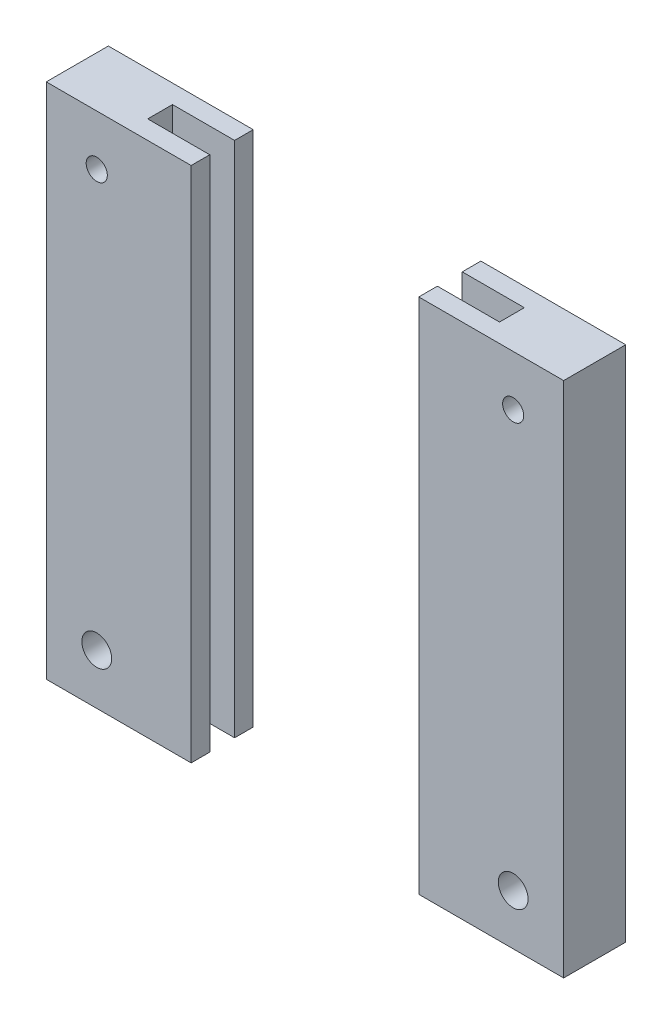
ISO-10303-21;
HEADER;
FILE_DESCRIPTION(('STEP AP214'),'2;1');
FILE_NAME('part.step','',(''),(''),'','','');
FILE_SCHEMA(('AUTOMOTIVE_DESIGN { 1 0 10303 214 1 1 1 1 }'));
ENDSEC;
DATA;
#1=APPLICATION_CONTEXT('core data for automotive mechanical design processes');
#2=APPLICATION_PROTOCOL_DEFINITION('international standard','automotive_design',2000,#1);
#3=PRODUCT_CONTEXT('',#1,'mechanical');
#4=PRODUCT('Part','Part','',(#3));
#5=PRODUCT_RELATED_PRODUCT_CATEGORY('part','',(#4));
#6=PRODUCT_DEFINITION_FORMATION('','',#4);
#7=PRODUCT_DEFINITION_CONTEXT('part definition',#1,'design');
#8=PRODUCT_DEFINITION('design','',#6,#7);
#9=PRODUCT_DEFINITION_SHAPE('','',#8);
#10=(LENGTH_UNIT() NAMED_UNIT(*) SI_UNIT(.MILLI.,.METRE.));
#11=(NAMED_UNIT(*) PLANE_ANGLE_UNIT() SI_UNIT($,.RADIAN.));
#12=(NAMED_UNIT(*) SI_UNIT($,.STERADIAN.) SOLID_ANGLE_UNIT());
#13=UNCERTAINTY_MEASURE_WITH_UNIT(LENGTH_MEASURE(1.E-05),#10,'distance_accuracy_value','');
#14=(GEOMETRIC_REPRESENTATION_CONTEXT(3) GLOBAL_UNCERTAINTY_ASSIGNED_CONTEXT((#13)) GLOBAL_UNIT_ASSIGNED_CONTEXT((#10,
#11,#12)) REPRESENTATION_CONTEXT('',''));
#15=CARTESIAN_POINT('',(0.,0.,0.));
#16=DIRECTION('',(0.,0.,1.));
#17=DIRECTION('',(1.,0.,0.));
#18=AXIS2_PLACEMENT_3D('',#15,#16,#17);
#19=CARTESIAN_POINT('',(0.,0.,15.));
#20=DIRECTION('',(0.,1.,0.));
#21=DIRECTION('',(0.,0.,1.));
#22=AXIS2_PLACEMENT_3D('',#19,#20,#21);
#23=PLANE('',#22);
#24=DIRECTION('',(1.,0.,0.));
#25=VECTOR('',#24,1.);
#26=CARTESIAN_POINT('',(0.,0.,0.));
#27=LINE('',#26,#25);
#28=CARTESIAN_POINT('',(0.,0.,0.));
#29=VERTEX_POINT('',#28);
#30=CARTESIAN_POINT('',(35.,0.,0.));
#31=VERTEX_POINT('',#30);
#32=EDGE_CURVE('E89',#29,#31,#27,.T.);
#33=ORIENTED_EDGE('',*,*,#32,.T.);
#34=DIRECTION('',(0.,0.,1.));
#35=VECTOR('',#34,1.);
#36=CARTESIAN_POINT('',(35.,0.,0.));
#37=LINE('',#36,#35);
#38=CARTESIAN_POINT('',(35.,0.,4.5));
#39=VERTEX_POINT('',#38);
#40=EDGE_CURVE('E80',#31,#39,#37,.T.);
#41=ORIENTED_EDGE('',*,*,#40,.T.);
#42=DIRECTION('',(-1.,0.,0.));
#43=VECTOR('',#42,1.);
#44=CARTESIAN_POINT('',(20.,0.,4.5));
#45=LINE('',#44,#43);
#46=CARTESIAN_POINT('',(20.,0.,4.5));
#47=VERTEX_POINT('',#46);
#48=EDGE_CURVE('E88',#39,#47,#45,.T.);
#49=ORIENTED_EDGE('',*,*,#48,.T.);
#50=DIRECTION('',(0.,0.,1.));
#51=VECTOR('',#50,1.);
#52=CARTESIAN_POINT('',(20.,0.,4.5));
#53=LINE('',#52,#51);
#54=CARTESIAN_POINT('',(20.,0.,10.5));
#55=VERTEX_POINT('',#54);
#56=EDGE_CURVE('E121',#47,#55,#53,.T.);
#57=ORIENTED_EDGE('',*,*,#56,.T.);
#58=DIRECTION('',(1.,0.,0.));
#59=VECTOR('',#58,1.);
#60=CARTESIAN_POINT('',(20.,0.,10.5));
#61=LINE('',#60,#59);
#62=CARTESIAN_POINT('',(35.,0.,10.5));
#63=VERTEX_POINT('',#62);
#64=EDGE_CURVE('E124',#55,#63,#61,.T.);
#65=ORIENTED_EDGE('',*,*,#64,.T.);
#66=CARTESIAN_POINT('',(35.,0.,15.));
#67=VERTEX_POINT('',#66);
#68=EDGE_CURVE('E91',#63,#67,#37,.T.);
#69=ORIENTED_EDGE('',*,*,#68,.T.);
#70=DIRECTION('',(1.,0.,0.));
#71=VECTOR('',#70,1.);
#72=CARTESIAN_POINT('',(0.,0.,15.));
#73=LINE('',#72,#71);
#74=CARTESIAN_POINT('',(0.,0.,15.));
#75=VERTEX_POINT('',#74);
#76=EDGE_CURVE('E114',#75,#67,#73,.T.);
#77=ORIENTED_EDGE('',*,*,#76,.F.);
#78=DIRECTION('',(0.,0.,-1.));
#79=VECTOR('',#78,1.);
#80=CARTESIAN_POINT('',(0.,0.,15.));
#81=LINE('',#80,#79);
#82=EDGE_CURVE('E105',#75,#29,#81,.T.);
#83=ORIENTED_EDGE('',*,*,#82,.T.);
#84=EDGE_LOOP('',(#33,#41,#49,#57,#65,#69,#77,#83));
#85=FACE_BOUND('',#84,.T.);
#86=ADVANCED_FACE('F44',(#85),#23,.F.);
#87=CARTESIAN_POINT('',(0.,125.,15.));
#88=DIRECTION('',(0.,1.,0.));
#89=DIRECTION('',(0.,0.,1.));
#90=AXIS2_PLACEMENT_3D('',#87,#88,#89);
#91=PLANE('',#90);
#92=DIRECTION('',(0.,0.,1.));
#93=VECTOR('',#92,1.);
#94=CARTESIAN_POINT('',(35.,125.,0.));
#95=LINE('',#94,#93);
#96=CARTESIAN_POINT('',(35.,125.,0.));
#97=VERTEX_POINT('',#96);
#98=CARTESIAN_POINT('',(35.,125.,4.5));
#99=VERTEX_POINT('',#98);
#100=EDGE_CURVE('E12',#97,#99,#95,.T.);
#101=ORIENTED_EDGE('',*,*,#100,.F.);
#102=DIRECTION('',(1.,0.,0.));
#103=VECTOR('',#102,1.);
#104=CARTESIAN_POINT('',(0.,125.,0.));
#105=LINE('',#104,#103);
#106=CARTESIAN_POINT('',(0.,125.,0.));
#107=VERTEX_POINT('',#106);
#108=EDGE_CURVE('E47',#107,#97,#105,.T.);
#109=ORIENTED_EDGE('',*,*,#108,.F.);
#110=DIRECTION('',(0.,0.,-1.));
#111=VECTOR('',#110,1.);
#112=CARTESIAN_POINT('',(0.,125.,15.));
#113=LINE('',#112,#111);
#114=CARTESIAN_POINT('',(0.,125.,15.));
#115=VERTEX_POINT('',#114);
#116=EDGE_CURVE('E142',#115,#107,#113,.T.);
#117=ORIENTED_EDGE('',*,*,#116,.F.);
#118=DIRECTION('',(1.,0.,0.));
#119=VECTOR('',#118,1.);
#120=CARTESIAN_POINT('',(0.,125.,15.));
#121=LINE('',#120,#119);
#122=CARTESIAN_POINT('',(35.,125.,15.));
#123=VERTEX_POINT('',#122);
#124=EDGE_CURVE('E111',#115,#123,#121,.T.);
#125=ORIENTED_EDGE('',*,*,#124,.T.);
#126=CARTESIAN_POINT('',(35.,125.,10.5));
#127=VERTEX_POINT('',#126);
#128=EDGE_CURVE('E55',#127,#123,#95,.T.);
#129=ORIENTED_EDGE('',*,*,#128,.F.);
#130=DIRECTION('',(1.,0.,0.));
#131=VECTOR('',#130,1.);
#132=CARTESIAN_POINT('',(0.,125.,10.5));
#133=LINE('',#132,#131);
#134=CARTESIAN_POINT('',(20.,125.,10.5));
#135=VERTEX_POINT('',#134);
#136=EDGE_CURVE('E134',#135,#127,#133,.T.);
#137=ORIENTED_EDGE('',*,*,#136,.F.);
#138=DIRECTION('',(0.,0.,1.));
#139=VECTOR('',#138,1.);
#140=CARTESIAN_POINT('',(20.,125.,15.));
#141=LINE('',#140,#139);
#142=CARTESIAN_POINT('',(20.,125.,4.5));
#143=VERTEX_POINT('',#142);
#144=EDGE_CURVE('E132',#143,#135,#141,.T.);
#145=ORIENTED_EDGE('',*,*,#144,.F.);
#146=DIRECTION('',(-1.,0.,0.));
#147=VECTOR('',#146,1.);
#148=CARTESIAN_POINT('',(0.,125.,4.5));
#149=LINE('',#148,#147);
#150=EDGE_CURVE('E131',#99,#143,#149,.T.);
#151=ORIENTED_EDGE('',*,*,#150,.F.);
#152=EDGE_LOOP('',(#101,#109,#117,#125,#129,#137,#145,#151));
#153=FACE_BOUND('',#152,.T.);
#154=ADVANCED_FACE('F174',(#153),#91,.T.);
#155=CARTESIAN_POINT('',(0.,0.,15.));
#156=DIRECTION('',(0.,0.,-1.));
#157=DIRECTION('',(-1.,0.,0.));
#158=AXIS2_PLACEMENT_3D('',#155,#156,#157);
#159=PLANE('',#158);
#160=CARTESIAN_POINT('',(12.2,112.8,15.));
#161=DIRECTION('',(0.,0.,1.));
#162=DIRECTION('',(1.,0.,0.));
#163=AXIS2_PLACEMENT_3D('',#160,#161,#162);
#164=CIRCLE('',#163,2.54999999999999);
#165=CARTESIAN_POINT('',(14.75,112.8,15.));
#166=VERTEX_POINT('',#165);
#167=EDGE_CURVE('E155',#166,#166,#164,.T.);
#168=ORIENTED_EDGE('',*,*,#167,.F.);
#169=EDGE_LOOP('',(#168));
#170=FACE_BOUND('',#169,.T.);
#171=CARTESIAN_POINT('',(12.2,12.2,15.));
#172=DIRECTION('',(0.,0.,1.));
#173=DIRECTION('',(1.,0.,0.));
#174=AXIS2_PLACEMENT_3D('',#171,#172,#173);
#175=CIRCLE('',#174,3.6);
#176=CARTESIAN_POINT('',(15.8,12.2,15.));
#177=VERTEX_POINT('',#176);
#178=EDGE_CURVE('E106',#177,#177,#175,.T.);
#179=ORIENTED_EDGE('',*,*,#178,.F.);
#180=EDGE_LOOP('',(#179));
#181=FACE_BOUND('',#180,.T.);
#182=ORIENTED_EDGE('',*,*,#76,.T.);
#183=DIRECTION('',(0.,1.,0.));
#184=VECTOR('',#183,1.);
#185=CARTESIAN_POINT('',(35.,0.,15.));
#186=LINE('',#185,#184);
#187=EDGE_CURVE('E116',#67,#123,#186,.T.);
#188=ORIENTED_EDGE('',*,*,#187,.T.);
#189=ORIENTED_EDGE('',*,*,#124,.F.);
#190=DIRECTION('',(0.,1.,0.));
#191=VECTOR('',#190,1.);
#192=CARTESIAN_POINT('',(0.,0.,15.));
#193=LINE('',#192,#191);
#194=EDGE_CURVE('E139',#75,#115,#193,.T.);
#195=ORIENTED_EDGE('',*,*,#194,.F.);
#196=EDGE_LOOP('',(#182,#188,#189,#195));
#197=FACE_BOUND('',#196,.T.);
#198=ADVANCED_FACE('F171',(#170,#181,#197),#159,.F.);
#199=CARTESIAN_POINT('',(0.,0.,0.));
#200=DIRECTION('',(0.,0.,-1.));
#201=DIRECTION('',(-1.,0.,0.));
#202=AXIS2_PLACEMENT_3D('',#199,#200,#201);
#203=PLANE('',#202);
#204=CARTESIAN_POINT('',(12.2,112.8,0.));
#205=DIRECTION('',(0.,0.,1.));
#206=DIRECTION('',(1.,0.,0.));
#207=AXIS2_PLACEMENT_3D('',#204,#205,#206);
#208=CIRCLE('',#207,2.54999999999999);
#209=CARTESIAN_POINT('',(14.75,112.8,0.));
#210=VERTEX_POINT('',#209);
#211=EDGE_CURVE('E158',#210,#210,#208,.T.);
#212=ORIENTED_EDGE('',*,*,#211,.T.);
#213=EDGE_LOOP('',(#212));
#214=FACE_BOUND('',#213,.T.);
#215=CARTESIAN_POINT('',(12.2,12.2,0.));
#216=DIRECTION('',(0.,0.,1.));
#217=DIRECTION('',(1.,0.,0.));
#218=AXIS2_PLACEMENT_3D('',#215,#216,#217);
#219=CIRCLE('',#218,3.6);
#220=CARTESIAN_POINT('',(15.8,12.2,0.));
#221=VERTEX_POINT('',#220);
#222=EDGE_CURVE('E108',#221,#221,#219,.T.);
#223=ORIENTED_EDGE('',*,*,#222,.T.);
#224=EDGE_LOOP('',(#223));
#225=FACE_BOUND('',#224,.T.);
#226=DIRECTION('',(0.,1.,0.));
#227=VECTOR('',#226,1.);
#228=CARTESIAN_POINT('',(35.,0.,0.));
#229=LINE('',#228,#227);
#230=EDGE_CURVE('E53',#31,#97,#229,.T.);
#231=ORIENTED_EDGE('',*,*,#230,.F.);
#232=ORIENTED_EDGE('',*,*,#32,.F.);
#233=DIRECTION('',(0.,1.,0.));
#234=VECTOR('',#233,1.);
#235=CARTESIAN_POINT('',(0.,0.,0.));
#236=LINE('',#235,#234);
#237=EDGE_CURVE('E120',#29,#107,#236,.T.);
#238=ORIENTED_EDGE('',*,*,#237,.T.);
#239=ORIENTED_EDGE('',*,*,#108,.T.);
#240=EDGE_LOOP('',(#231,#232,#238,#239));
#241=FACE_BOUND('',#240,.T.);
#242=ADVANCED_FACE('F95',(#214,#225,#241),#203,.T.);
#243=CARTESIAN_POINT('',(0.,0.,15.));
#244=DIRECTION('',(-1.,0.,0.));
#245=DIRECTION('',(0.,0.,1.));
#246=AXIS2_PLACEMENT_3D('',#243,#244,#245);
#247=PLANE('',#246);
#248=ORIENTED_EDGE('',*,*,#237,.F.);
#249=ORIENTED_EDGE('',*,*,#82,.F.);
#250=ORIENTED_EDGE('',*,*,#194,.T.);
#251=ORIENTED_EDGE('',*,*,#116,.T.);
#252=EDGE_LOOP('',(#248,#249,#250,#251));
#253=FACE_BOUND('',#252,.T.);
#254=ADVANCED_FACE('F214',(#253),#247,.T.);
#255=CARTESIAN_POINT('',(20.,0.,4.5));
#256=DIRECTION('',(-1.,0.,0.));
#257=DIRECTION('',(0.,0.,1.));
#258=AXIS2_PLACEMENT_3D('',#255,#256,#257);
#259=PLANE('',#258);
#260=ORIENTED_EDGE('',*,*,#144,.T.);
#261=DIRECTION('',(0.,1.,0.));
#262=VECTOR('',#261,1.);
#263=CARTESIAN_POINT('',(20.,0.,10.5));
#264=LINE('',#263,#262);
#265=EDGE_CURVE('E136',#55,#135,#264,.T.);
#266=ORIENTED_EDGE('',*,*,#265,.F.);
#267=ORIENTED_EDGE('',*,*,#56,.F.);
#268=DIRECTION('',(0.,1.,0.));
#269=VECTOR('',#268,1.);
#270=CARTESIAN_POINT('',(20.,0.,4.5));
#271=LINE('',#270,#269);
#272=EDGE_CURVE('E128',#47,#143,#271,.T.);
#273=ORIENTED_EDGE('',*,*,#272,.T.);
#274=EDGE_LOOP('',(#260,#266,#267,#273));
#275=FACE_BOUND('',#274,.T.);
#276=ADVANCED_FACE('F210',(#275),#259,.F.);
#277=CARTESIAN_POINT('',(20.,0.,4.5));
#278=DIRECTION('',(0.,0.,-1.));
#279=DIRECTION('',(-1.,0.,0.));
#280=AXIS2_PLACEMENT_3D('',#277,#278,#279);
#281=PLANE('',#280);
#282=ORIENTED_EDGE('',*,*,#150,.T.);
#283=ORIENTED_EDGE('',*,*,#272,.F.);
#284=ORIENTED_EDGE('',*,*,#48,.F.);
#285=DIRECTION('',(0.,1.,0.));
#286=VECTOR('',#285,1.);
#287=CARTESIAN_POINT('',(35.,0.,4.5));
#288=LINE('',#287,#286);
#289=EDGE_CURVE('E62',#39,#99,#288,.T.);
#290=ORIENTED_EDGE('',*,*,#289,.T.);
#291=EDGE_LOOP('',(#282,#283,#284,#290));
#292=FACE_BOUND('',#291,.T.);
#293=ADVANCED_FACE('F215',(#292),#281,.F.);
#294=CARTESIAN_POINT('',(20.,0.,10.5));
#295=DIRECTION('',(0.,0.,1.));
#296=DIRECTION('',(1.,0.,0.));
#297=AXIS2_PLACEMENT_3D('',#294,#295,#296);
#298=PLANE('',#297);
#299=ORIENTED_EDGE('',*,*,#136,.T.);
#300=DIRECTION('',(0.,1.,0.));
#301=VECTOR('',#300,1.);
#302=CARTESIAN_POINT('',(35.,0.,10.5));
#303=LINE('',#302,#301);
#304=EDGE_CURVE('E100',#63,#127,#303,.T.);
#305=ORIENTED_EDGE('',*,*,#304,.F.);
#306=ORIENTED_EDGE('',*,*,#64,.F.);
#307=ORIENTED_EDGE('',*,*,#265,.T.);
#308=EDGE_LOOP('',(#299,#305,#306,#307));
#309=FACE_BOUND('',#308,.T.);
#310=ADVANCED_FACE('F207',(#309),#298,.F.);
#311=CARTESIAN_POINT('',(35.,0.,0.));
#312=DIRECTION('',(-1.,0.,0.));
#313=DIRECTION('',(0.,0.,1.));
#314=AXIS2_PLACEMENT_3D('',#311,#312,#313);
#315=PLANE('',#314);
#316=ORIENTED_EDGE('',*,*,#128,.T.);
#317=ORIENTED_EDGE('',*,*,#187,.F.);
#318=ORIENTED_EDGE('',*,*,#68,.F.);
#319=ORIENTED_EDGE('',*,*,#304,.T.);
#320=EDGE_LOOP('',(#316,#317,#318,#319));
#321=FACE_BOUND('',#320,.T.);
#322=ADVANCED_FACE('F205',(#321),#315,.F.);
#323=ORIENTED_EDGE('',*,*,#40,.F.);
#324=ORIENTED_EDGE('',*,*,#230,.T.);
#325=ORIENTED_EDGE('',*,*,#100,.T.);
#326=ORIENTED_EDGE('',*,*,#289,.F.);
#327=EDGE_LOOP('',(#323,#324,#325,#326));
#328=FACE_BOUND('',#327,.T.);
#329=ADVANCED_FACE('F82',(#328),#315,.F.);
#330=CARTESIAN_POINT('',(12.2,12.2,15.));
#331=DIRECTION('',(0.,0.,-1.));
#332=DIRECTION('',(1.,0.,0.));
#333=AXIS2_PLACEMENT_3D('',#330,#331,#332);
#334=CYLINDRICAL_SURFACE('',#333,3.6);
#335=ORIENTED_EDGE('',*,*,#222,.F.);
#336=EDGE_LOOP('',(#335));
#337=FACE_BOUND('',#336,.T.);
#338=ORIENTED_EDGE('',*,*,#178,.T.);
#339=EDGE_LOOP('',(#338));
#340=FACE_BOUND('',#339,.T.);
#341=ADVANCED_FACE('F167',(#337,#340),#334,.F.);
#342=CARTESIAN_POINT('',(12.2,112.8,15.));
#343=DIRECTION('',(0.,0.,-1.));
#344=DIRECTION('',(1.,0.,0.));
#345=AXIS2_PLACEMENT_3D('',#342,#343,#344);
#346=CYLINDRICAL_SURFACE('',#345,2.54999999999999);
#347=ORIENTED_EDGE('',*,*,#211,.F.);
#348=EDGE_LOOP('',(#347));
#349=FACE_BOUND('',#348,.T.);
#350=ORIENTED_EDGE('',*,*,#167,.T.);
#351=EDGE_LOOP('',(#350));
#352=FACE_BOUND('',#351,.T.);
#353=ADVANCED_FACE('F164',(#349,#352),#346,.F.);
#354=CLOSED_SHELL('',(#86,#154,#198,#242,#254,#276,#293,#310,#322,#329,#341,#353));
#355=MANIFOLD_SOLID_BREP('B2',#354);
#356=CARTESIAN_POINT('',(125.,0.,15.));
#357=DIRECTION('',(-1.,0.,0.));
#358=DIRECTION('',(0.,0.,1.));
#359=AXIS2_PLACEMENT_3D('',#356,#357,#358);
#360=PLANE('',#359);
#361=DIRECTION('',(0.,1.,0.));
#362=VECTOR('',#361,1.);
#363=CARTESIAN_POINT('',(125.,0.,0.));
#364=LINE('',#363,#362);
#365=CARTESIAN_POINT('',(125.,0.,0.));
#366=VERTEX_POINT('',#365);
#367=CARTESIAN_POINT('',(125.,125.,0.));
#368=VERTEX_POINT('',#367);
#369=EDGE_CURVE('E410',#366,#368,#364,.T.);
#370=ORIENTED_EDGE('',*,*,#369,.T.);
#371=DIRECTION('',(0.,0.,-1.));
#372=VECTOR('',#371,1.);
#373=CARTESIAN_POINT('',(125.,125.,15.));
#374=LINE('',#373,#372);
#375=CARTESIAN_POINT('',(125.,125.,15.));
#376=VERTEX_POINT('',#375);
#377=EDGE_CURVE('E400',#376,#368,#374,.T.);
#378=ORIENTED_EDGE('',*,*,#377,.F.);
#379=DIRECTION('',(0.,1.,0.));
#380=VECTOR('',#379,1.);
#381=CARTESIAN_POINT('',(125.,0.,15.));
#382=LINE('',#381,#380);
#383=CARTESIAN_POINT('',(125.,0.,15.));
#384=VERTEX_POINT('',#383);
#385=EDGE_CURVE('E401',#384,#376,#382,.T.);
#386=ORIENTED_EDGE('',*,*,#385,.F.);
#387=DIRECTION('',(0.,0.,-1.));
#388=VECTOR('',#387,1.);
#389=CARTESIAN_POINT('',(125.,0.,15.));
#390=LINE('',#389,#388);
#391=EDGE_CURVE('E398',#384,#366,#390,.T.);
#392=ORIENTED_EDGE('',*,*,#391,.T.);
#393=EDGE_LOOP('',(#370,#378,#386,#392));
#394=FACE_BOUND('',#393,.T.);
#395=ADVANCED_FACE('F310',(#394),#360,.F.);
#396=CARTESIAN_POINT('',(105.,0.,4.5));
#397=DIRECTION('',(-1.,0.,0.));
#398=DIRECTION('',(0.,0.,1.));
#399=AXIS2_PLACEMENT_3D('',#396,#397,#398);
#400=PLANE('',#399);
#401=DIRECTION('',(0.,1.,0.));
#402=VECTOR('',#401,1.);
#403=CARTESIAN_POINT('',(105.,0.,4.5));
#404=LINE('',#403,#402);
#405=CARTESIAN_POINT('',(105.,0.,4.5));
#406=VERTEX_POINT('',#405);
#407=CARTESIAN_POINT('',(105.,125.,4.5));
#408=VERTEX_POINT('',#407);
#409=EDGE_CURVE('E333',#406,#408,#404,.T.);
#410=ORIENTED_EDGE('',*,*,#409,.F.);
#411=DIRECTION('',(0.,0.,1.));
#412=VECTOR('',#411,1.);
#413=CARTESIAN_POINT('',(105.,0.,4.5));
#414=LINE('',#413,#412);
#415=CARTESIAN_POINT('',(105.,0.,10.5));
#416=VERTEX_POINT('',#415);
#417=EDGE_CURVE('E429',#406,#416,#414,.T.);
#418=ORIENTED_EDGE('',*,*,#417,.T.);
#419=DIRECTION('',(0.,1.,0.));
#420=VECTOR('',#419,1.);
#421=CARTESIAN_POINT('',(105.,0.,10.5));
#422=LINE('',#421,#420);
#423=CARTESIAN_POINT('',(105.,125.,10.5));
#424=VERTEX_POINT('',#423);
#425=EDGE_CURVE('E411',#416,#424,#422,.T.);
#426=ORIENTED_EDGE('',*,*,#425,.T.);
#427=DIRECTION('',(0.,0.,1.));
#428=VECTOR('',#427,1.);
#429=CARTESIAN_POINT('',(105.,125.,15.));
#430=LINE('',#429,#428);
#431=EDGE_CURVE('E42',#408,#424,#430,.T.);
#432=ORIENTED_EDGE('',*,*,#431,.F.);
#433=EDGE_LOOP('',(#410,#418,#426,#432));
#434=FACE_BOUND('',#433,.T.);
#435=ADVANCED_FACE('F427',(#434),#400,.T.);
#436=CARTESIAN_POINT('',(105.,0.,10.5));
#437=DIRECTION('',(0.,0.,-1.));
#438=DIRECTION('',(-1.,0.,0.));
#439=AXIS2_PLACEMENT_3D('',#436,#437,#438);
#440=PLANE('',#439);
#441=ORIENTED_EDGE('',*,*,#425,.F.);
#442=DIRECTION('',(-1.,0.,0.));
#443=VECTOR('',#442,1.);
#444=CARTESIAN_POINT('',(105.,0.,10.5));
#445=LINE('',#444,#443);
#446=CARTESIAN_POINT('',(90.,0.,10.5));
#447=VERTEX_POINT('',#446);
#448=EDGE_CURVE('E434',#416,#447,#445,.T.);
#449=ORIENTED_EDGE('',*,*,#448,.T.);
#450=DIRECTION('',(0.,1.,0.));
#451=VECTOR('',#450,1.);
#452=CARTESIAN_POINT('',(90.,0.,10.5));
#453=LINE('',#452,#451);
#454=CARTESIAN_POINT('',(90.,125.,10.5));
#455=VERTEX_POINT('',#454);
#456=EDGE_CURVE('E381',#447,#455,#453,.T.);
#457=ORIENTED_EDGE('',*,*,#456,.T.);
#458=DIRECTION('',(-1.,0.,0.));
#459=VECTOR('',#458,1.);
#460=CARTESIAN_POINT('',(0.,125.,10.5));
#461=LINE('',#460,#459);
#462=EDGE_CURVE('E318',#424,#455,#461,.T.);
#463=ORIENTED_EDGE('',*,*,#462,.F.);
#464=EDGE_LOOP('',(#441,#449,#457,#463));
#465=FACE_BOUND('',#464,.T.);
#466=ADVANCED_FACE('F425',(#465),#440,.T.);
#467=CARTESIAN_POINT('',(105.,0.,4.5));
#468=DIRECTION('',(0.,0.,1.));
#469=DIRECTION('',(1.,0.,0.));
#470=AXIS2_PLACEMENT_3D('',#467,#468,#469);
#471=PLANE('',#470);
#472=DIRECTION('',(0.,1.,0.));
#473=VECTOR('',#472,1.);
#474=CARTESIAN_POINT('',(90.,0.,4.5));
#475=LINE('',#474,#473);
#476=CARTESIAN_POINT('',(90.,0.,4.5));
#477=VERTEX_POINT('',#476);
#478=CARTESIAN_POINT('',(90.,125.,4.5));
#479=VERTEX_POINT('',#478);
#480=EDGE_CURVE('E431',#477,#479,#475,.T.);
#481=ORIENTED_EDGE('',*,*,#480,.F.);
#482=DIRECTION('',(1.,0.,0.));
#483=VECTOR('',#482,1.);
#484=CARTESIAN_POINT('',(105.,0.,4.5));
#485=LINE('',#484,#483);
#486=EDGE_CURVE('E452',#477,#406,#485,.T.);
#487=ORIENTED_EDGE('',*,*,#486,.T.);
#488=ORIENTED_EDGE('',*,*,#409,.T.);
#489=DIRECTION('',(1.,0.,0.));
#490=VECTOR('',#489,1.);
#491=CARTESIAN_POINT('',(0.,125.,4.5));
#492=LINE('',#491,#490);
#493=EDGE_CURVE('E416',#479,#408,#492,.T.);
#494=ORIENTED_EDGE('',*,*,#493,.F.);
#495=EDGE_LOOP('',(#481,#487,#488,#494));
#496=FACE_BOUND('',#495,.T.);
#497=ADVANCED_FACE('F450',(#496),#471,.T.);
#498=CARTESIAN_POINT('',(0.,0.,0.));
#499=DIRECTION('',(0.,0.,-1.));
#500=DIRECTION('',(-1.,0.,0.));
#501=AXIS2_PLACEMENT_3D('',#498,#499,#500);
#502=PLANE('',#501);
#503=CARTESIAN_POINT('',(112.8,12.2,0.));
#504=DIRECTION('',(0.,0.,-1.));
#505=DIRECTION('',(-1.,0.,0.));
#506=AXIS2_PLACEMENT_3D('',#503,#504,#505);
#507=CIRCLE('',#506,3.6);
#508=CARTESIAN_POINT('',(109.2,12.2,0.));
#509=VERTEX_POINT('',#508);
#510=EDGE_CURVE('E448',#509,#509,#507,.T.);
#511=ORIENTED_EDGE('',*,*,#510,.F.);
#512=EDGE_LOOP('',(#511));
#513=FACE_BOUND('',#512,.T.);
#514=CARTESIAN_POINT('',(112.8,112.8,0.));
#515=DIRECTION('',(0.,0.,-1.));
#516=DIRECTION('',(-1.,0.,0.));
#517=AXIS2_PLACEMENT_3D('',#514,#515,#516);
#518=CIRCLE('',#517,2.54999999999999);
#519=CARTESIAN_POINT('',(110.25,112.8,0.));
#520=VERTEX_POINT('',#519);
#521=EDGE_CURVE('E458',#520,#520,#518,.T.);
#522=ORIENTED_EDGE('',*,*,#521,.F.);
#523=EDGE_LOOP('',(#522));
#524=FACE_BOUND('',#523,.T.);
#525=DIRECTION('',(0.,1.,0.));
#526=VECTOR('',#525,1.);
#527=CARTESIAN_POINT('',(90.,0.,0.));
#528=LINE('',#527,#526);
#529=CARTESIAN_POINT('',(90.,0.,0.));
#530=VERTEX_POINT('',#529);
#531=CARTESIAN_POINT('',(90.,125.,0.));
#532=VERTEX_POINT('',#531);
#533=EDGE_CURVE('E394',#530,#532,#528,.T.);
#534=ORIENTED_EDGE('',*,*,#533,.T.);
#535=DIRECTION('',(1.,0.,0.));
#536=VECTOR('',#535,1.);
#537=CARTESIAN_POINT('',(0.,125.,0.));
#538=LINE('',#537,#536);
#539=EDGE_CURVE('E408',#532,#368,#538,.T.);
#540=ORIENTED_EDGE('',*,*,#539,.T.);
#541=ORIENTED_EDGE('',*,*,#369,.F.);
#542=DIRECTION('',(1.,0.,0.));
#543=VECTOR('',#542,1.);
#544=CARTESIAN_POINT('',(0.,0.,0.));
#545=LINE('',#544,#543);
#546=EDGE_CURVE('E414',#530,#366,#545,.T.);
#547=ORIENTED_EDGE('',*,*,#546,.F.);
#548=EDGE_LOOP('',(#534,#540,#541,#547));
#549=FACE_BOUND('',#548,.T.);
#550=ADVANCED_FACE('F445',(#513,#524,#549),#502,.T.);
#551=CARTESIAN_POINT('',(0.,0.,15.));
#552=DIRECTION('',(0.,0.,-1.));
#553=DIRECTION('',(-1.,0.,0.));
#554=AXIS2_PLACEMENT_3D('',#551,#552,#553);
#555=PLANE('',#554);
#556=CARTESIAN_POINT('',(112.8,12.2,15.));
#557=DIRECTION('',(0.,0.,-1.));
#558=DIRECTION('',(-1.,0.,0.));
#559=AXIS2_PLACEMENT_3D('',#556,#557,#558);
#560=CIRCLE('',#559,3.6);
#561=CARTESIAN_POINT('',(109.2,12.2,15.));
#562=VERTEX_POINT('',#561);
#563=EDGE_CURVE('E461',#562,#562,#560,.T.);
#564=ORIENTED_EDGE('',*,*,#563,.T.);
#565=EDGE_LOOP('',(#564));
#566=FACE_BOUND('',#565,.T.);
#567=CARTESIAN_POINT('',(112.8,112.8,15.));
#568=DIRECTION('',(0.,0.,-1.));
#569=DIRECTION('',(-1.,0.,0.));
#570=AXIS2_PLACEMENT_3D('',#567,#568,#569);
#571=CIRCLE('',#570,2.54999999999999);
#572=CARTESIAN_POINT('',(110.25,112.8,15.));
#573=VERTEX_POINT('',#572);
#574=EDGE_CURVE('E462',#573,#573,#571,.T.);
#575=ORIENTED_EDGE('',*,*,#574,.T.);
#576=EDGE_LOOP('',(#575));
#577=FACE_BOUND('',#576,.T.);
#578=DIRECTION('',(1.,0.,0.));
#579=VECTOR('',#578,1.);
#580=CARTESIAN_POINT('',(0.,125.,15.));
#581=LINE('',#580,#579);
#582=CARTESIAN_POINT('',(90.,125.,15.));
#583=VERTEX_POINT('',#582);
#584=EDGE_CURVE('E393',#583,#376,#581,.T.);
#585=ORIENTED_EDGE('',*,*,#584,.F.);
#586=DIRECTION('',(0.,1.,0.));
#587=VECTOR('',#586,1.);
#588=CARTESIAN_POINT('',(90.,0.,15.));
#589=LINE('',#588,#587);
#590=CARTESIAN_POINT('',(90.,0.,15.));
#591=VERTEX_POINT('',#590);
#592=EDGE_CURVE('E378',#591,#583,#589,.T.);
#593=ORIENTED_EDGE('',*,*,#592,.F.);
#594=DIRECTION('',(1.,0.,0.));
#595=VECTOR('',#594,1.);
#596=CARTESIAN_POINT('',(0.,0.,15.));
#597=LINE('',#596,#595);
#598=EDGE_CURVE('E391',#591,#384,#597,.T.);
#599=ORIENTED_EDGE('',*,*,#598,.T.);
#600=ORIENTED_EDGE('',*,*,#385,.T.);
#601=EDGE_LOOP('',(#585,#593,#599,#600));
#602=FACE_BOUND('',#601,.T.);
#603=ADVANCED_FACE('F389',(#566,#577,#602),#555,.F.);
#604=CARTESIAN_POINT('',(0.,125.,15.));
#605=DIRECTION('',(0.,1.,0.));
#606=DIRECTION('',(0.,0.,1.));
#607=AXIS2_PLACEMENT_3D('',#604,#605,#606);
#608=PLANE('',#607);
#609=DIRECTION('',(0.,0.,-1.));
#610=VECTOR('',#609,1.);
#611=CARTESIAN_POINT('',(90.,125.,0.));
#612=LINE('',#611,#610);
#613=EDGE_CURVE('E421',#583,#455,#612,.T.);
#614=ORIENTED_EDGE('',*,*,#613,.F.);
#615=ORIENTED_EDGE('',*,*,#584,.T.);
#616=ORIENTED_EDGE('',*,*,#377,.T.);
#617=ORIENTED_EDGE('',*,*,#539,.F.);
#618=EDGE_CURVE('E447',#479,#532,#612,.T.);
#619=ORIENTED_EDGE('',*,*,#618,.F.);
#620=ORIENTED_EDGE('',*,*,#493,.T.);
#621=ORIENTED_EDGE('',*,*,#431,.T.);
#622=ORIENTED_EDGE('',*,*,#462,.T.);
#623=EDGE_LOOP('',(#614,#615,#616,#617,#619,#620,#621,#622));
#624=FACE_BOUND('',#623,.T.);
#625=ADVANCED_FACE('F312',(#624),#608,.T.);
#626=CARTESIAN_POINT('',(0.,0.,15.));
#627=DIRECTION('',(0.,1.,0.));
#628=DIRECTION('',(0.,0.,1.));
#629=AXIS2_PLACEMENT_3D('',#626,#627,#628);
#630=PLANE('',#629);
#631=ORIENTED_EDGE('',*,*,#598,.F.);
#632=DIRECTION('',(0.,0.,-1.));
#633=VECTOR('',#632,1.);
#634=CARTESIAN_POINT('',(90.,0.,0.));
#635=LINE('',#634,#633);
#636=EDGE_CURVE('E375',#591,#447,#635,.T.);
#637=ORIENTED_EDGE('',*,*,#636,.T.);
#638=ORIENTED_EDGE('',*,*,#448,.F.);
#639=ORIENTED_EDGE('',*,*,#417,.F.);
#640=ORIENTED_EDGE('',*,*,#486,.F.);
#641=EDGE_CURVE('E325',#477,#530,#635,.T.);
#642=ORIENTED_EDGE('',*,*,#641,.T.);
#643=ORIENTED_EDGE('',*,*,#546,.T.);
#644=ORIENTED_EDGE('',*,*,#391,.F.);
#645=EDGE_LOOP('',(#631,#637,#638,#639,#640,#642,#643,#644));
#646=FACE_BOUND('',#645,.T.);
#647=ADVANCED_FACE('F396',(#646),#630,.F.);
#648=CARTESIAN_POINT('',(90.,0.,0.));
#649=DIRECTION('',(1.,0.,0.));
#650=DIRECTION('',(0.,0.,-1.));
#651=AXIS2_PLACEMENT_3D('',#648,#649,#650);
#652=PLANE('',#651);
#653=ORIENTED_EDGE('',*,*,#480,.T.);
#654=ORIENTED_EDGE('',*,*,#618,.T.);
#655=ORIENTED_EDGE('',*,*,#533,.F.);
#656=ORIENTED_EDGE('',*,*,#641,.F.);
#657=EDGE_LOOP('',(#653,#654,#655,#656));
#658=FACE_BOUND('',#657,.T.);
#659=ADVANCED_FACE('F488',(#658),#652,.F.);
#660=ORIENTED_EDGE('',*,*,#456,.F.);
#661=ORIENTED_EDGE('',*,*,#636,.F.);
#662=ORIENTED_EDGE('',*,*,#592,.T.);
#663=ORIENTED_EDGE('',*,*,#613,.T.);
#664=EDGE_LOOP('',(#660,#661,#662,#663));
#665=FACE_BOUND('',#664,.T.);
#666=ADVANCED_FACE('F377',(#665),#652,.F.);
#667=CARTESIAN_POINT('',(112.8,112.8,15.));
#668=DIRECTION('',(0.,0.,-1.));
#669=DIRECTION('',(-1.,0.,0.));
#670=AXIS2_PLACEMENT_3D('',#667,#668,#669);
#671=CYLINDRICAL_SURFACE('',#670,2.54999999999999);
#672=ORIENTED_EDGE('',*,*,#521,.T.);
#673=EDGE_LOOP('',(#672));
#674=FACE_BOUND('',#673,.T.);
#675=ORIENTED_EDGE('',*,*,#574,.F.);
#676=EDGE_LOOP('',(#675));
#677=FACE_BOUND('',#676,.T.);
#678=ADVANCED_FACE('F472',(#674,#677),#671,.F.);
#679=CARTESIAN_POINT('',(112.8,12.2,15.));
#680=DIRECTION('',(0.,0.,-1.));
#681=DIRECTION('',(-1.,0.,0.));
#682=AXIS2_PLACEMENT_3D('',#679,#680,#681);
#683=CYLINDRICAL_SURFACE('',#682,3.6);
#684=ORIENTED_EDGE('',*,*,#510,.T.);
#685=EDGE_LOOP('',(#684));
#686=FACE_BOUND('',#685,.T.);
#687=ORIENTED_EDGE('',*,*,#563,.F.);
#688=EDGE_LOOP('',(#687));
#689=FACE_BOUND('',#688,.T.);
#690=ADVANCED_FACE('F470',(#686,#689),#683,.F.);
#691=CLOSED_SHELL('',(#395,#435,#466,#497,#550,#603,#625,#647,#659,#666,#678,#690));
#692=MANIFOLD_SOLID_BREP('B6',#691);
#693=ADVANCED_BREP_SHAPE_REPRESENTATION('',(#18,#355,#692),#14);
#694=SHAPE_DEFINITION_REPRESENTATION(#9,#693);
ENDSEC;
END-ISO-10303-21;
